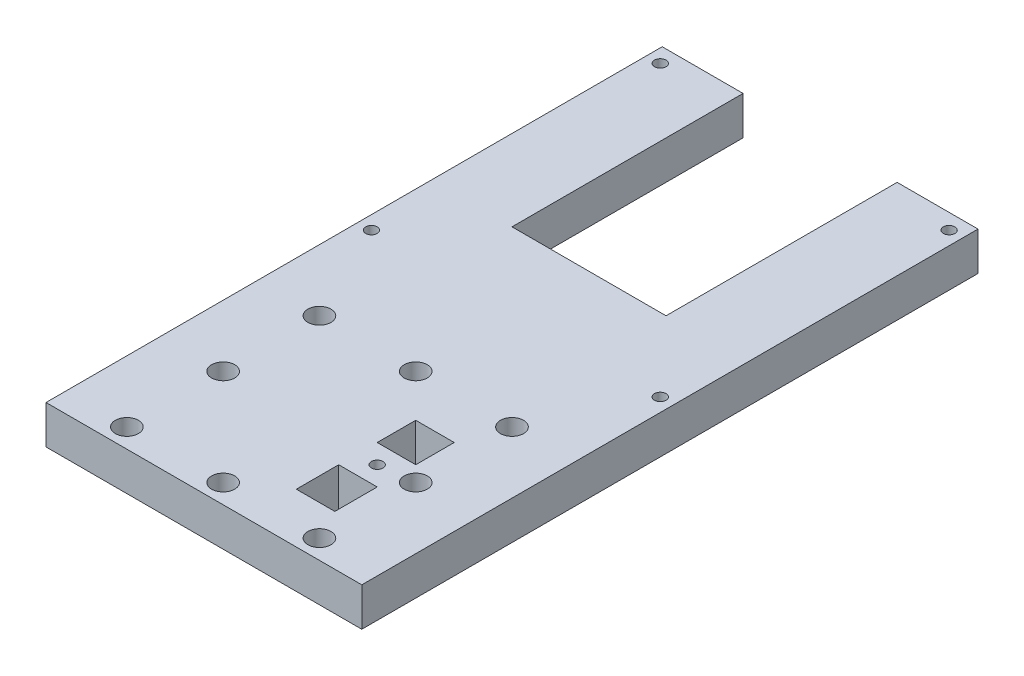
ISO-10303-21;
HEADER;
FILE_DESCRIPTION(('STEP AP214'),'2;1');
FILE_NAME('part.step','',(''),(''),'','','');
FILE_SCHEMA(('AUTOMOTIVE_DESIGN { 1 0 10303 214 1 1 1 1 }'));
ENDSEC;
DATA;
#1=APPLICATION_CONTEXT('core data for automotive mechanical design processes');
#2=APPLICATION_PROTOCOL_DEFINITION('international standard','automotive_design',2000,#1);
#3=PRODUCT_CONTEXT('',#1,'mechanical');
#4=PRODUCT('Part','Part','',(#3));
#5=PRODUCT_RELATED_PRODUCT_CATEGORY('part','',(#4));
#6=PRODUCT_DEFINITION_FORMATION('','',#4);
#7=PRODUCT_DEFINITION_CONTEXT('part definition',#1,'design');
#8=PRODUCT_DEFINITION('design','',#6,#7);
#9=PRODUCT_DEFINITION_SHAPE('','',#8);
#10=(LENGTH_UNIT() NAMED_UNIT(*) SI_UNIT(.MILLI.,.METRE.));
#11=(NAMED_UNIT(*) PLANE_ANGLE_UNIT() SI_UNIT($,.RADIAN.));
#12=(NAMED_UNIT(*) SI_UNIT($,.STERADIAN.) SOLID_ANGLE_UNIT());
#13=UNCERTAINTY_MEASURE_WITH_UNIT(LENGTH_MEASURE(1.E-05),#10,'distance_accuracy_value','');
#14=(GEOMETRIC_REPRESENTATION_CONTEXT(3) GLOBAL_UNCERTAINTY_ASSIGNED_CONTEXT((#13)) GLOBAL_UNIT_ASSIGNED_CONTEXT((#10,
#11,#12)) REPRESENTATION_CONTEXT('',''));
#15=CARTESIAN_POINT('',(0.,0.,0.));
#16=DIRECTION('',(0.,0.,1.));
#17=DIRECTION('',(1.,0.,0.));
#18=AXIS2_PLACEMENT_3D('',#15,#16,#17);
#19=CARTESIAN_POINT('',(0.,10.,0.));
#20=DIRECTION('',(0.,1.,0.));
#21=DIRECTION('',(0.,0.,1.));
#22=AXIS2_PLACEMENT_3D('',#19,#20,#21);
#23=PLANE('',#22);
#24=CARTESIAN_POINT('',(-8.03079687654243,10.,59.7441153686358));
#25=DIRECTION('',(0.,1.,0.));
#26=DIRECTION('',(0.,0.,1.));
#27=AXIS2_PLACEMENT_3D('',#24,#25,#26);
#28=CIRCLE('',#27,3.);
#29=CARTESIAN_POINT('',(-8.03079687654243,10.,62.7441153686358));
#30=VERTEX_POINT('',#29);
#31=EDGE_CURVE('E429',#30,#30,#28,.T.);
#32=ORIENTED_EDGE('',*,*,#31,.F.);
#33=EDGE_LOOP('',(#32));
#34=FACE_BOUND('',#33,.T.);
#35=CARTESIAN_POINT('',(-33.0307968765424,10.,34.7441153686358));
#36=DIRECTION('',(0.,1.,0.));
#37=DIRECTION('',(0.,0.,1.));
#38=AXIS2_PLACEMENT_3D('',#35,#36,#37);
#39=CIRCLE('',#38,3.);
#40=CARTESIAN_POINT('',(-33.0307968765424,10.,37.7441153686358));
#41=VERTEX_POINT('',#40);
#42=EDGE_CURVE('E437',#41,#41,#39,.T.);
#43=ORIENTED_EDGE('',*,*,#42,.F.);
#44=EDGE_LOOP('',(#43));
#45=FACE_BOUND('',#44,.T.);
#46=DIRECTION('',(-1.,0.,0.));
#47=VECTOR('',#46,1.);
#48=CARTESIAN_POINT('',(12.9692031234576,10.,20.7441153686358));
#49=LINE('',#48,#47);
#50=CARTESIAN_POINT('',(12.9692031234576,10.,20.7441153686358));
#51=VERTEX_POINT('',#50);
#52=CARTESIAN_POINT('',(2.96920312345755,10.,20.7441153686358));
#53=VERTEX_POINT('',#52);
#54=EDGE_CURVE('E155',#51,#53,#49,.T.);
#55=ORIENTED_EDGE('',*,*,#54,.F.);
#56=DIRECTION('',(0.,0.,-1.));
#57=VECTOR('',#56,1.);
#58=CARTESIAN_POINT('',(12.9692031234576,10.,30.7441153686358));
#59=LINE('',#58,#57);
#60=CARTESIAN_POINT('',(12.9692031234576,10.,30.7441153686358));
#61=VERTEX_POINT('',#60);
#62=EDGE_CURVE('E147',#61,#51,#59,.T.);
#63=ORIENTED_EDGE('',*,*,#62,.F.);
#64=DIRECTION('',(1.,0.,0.));
#65=VECTOR('',#64,1.);
#66=CARTESIAN_POINT('',(12.9692031234576,10.,30.7441153686358));
#67=LINE('',#66,#65);
#68=CARTESIAN_POINT('',(2.96920312345755,10.,30.7441153686358));
#69=VERTEX_POINT('',#68);
#70=EDGE_CURVE('E170',#69,#61,#67,.T.);
#71=ORIENTED_EDGE('',*,*,#70,.F.);
#72=DIRECTION('',(0.,0.,1.));
#73=VECTOR('',#72,1.);
#74=CARTESIAN_POINT('',(2.96920312345755,10.,30.7441153686358));
#75=LINE('',#74,#73);
#76=EDGE_CURVE('E168',#53,#69,#75,.T.);
#77=ORIENTED_EDGE('',*,*,#76,.F.);
#78=EDGE_LOOP('',(#55,#63,#71,#77));
#79=FACE_BOUND('',#78,.T.);
#80=CARTESIAN_POINT('',(-45.5307968765424,10.,-16.2558846313642));
#81=DIRECTION('',(0.,1.,0.));
#82=DIRECTION('',(0.,0.,1.));
#83=AXIS2_PLACEMENT_3D('',#80,#81,#82);
#84=CIRCLE('',#83,1.5);
#85=CARTESIAN_POINT('',(-45.5307968765424,10.,-14.7558846313642));
#86=VERTEX_POINT('',#85);
#87=EDGE_CURVE('E186',#86,#86,#84,.T.);
#88=ORIENTED_EDGE('',*,*,#87,.F.);
#89=EDGE_LOOP('',(#88));
#90=FACE_BOUND('',#89,.T.);
#91=CARTESIAN_POINT('',(29.4692031234568,10.,-91.2558846313642));
#92=DIRECTION('',(0.,1.,0.));
#93=DIRECTION('',(0.,0.,1.));
#94=AXIS2_PLACEMENT_3D('',#91,#92,#93);
#95=CIRCLE('',#94,1.5);
#96=CARTESIAN_POINT('',(29.4692031234568,10.,-89.7558846313642));
#97=VERTEX_POINT('',#96);
#98=EDGE_CURVE('E198',#97,#97,#95,.T.);
#99=ORIENTED_EDGE('',*,*,#98,.F.);
#100=EDGE_LOOP('',(#99));
#101=FACE_BOUND('',#100,.T.);
#102=CARTESIAN_POINT('',(-33.0307968765424,10.,9.7441153686358));
#103=DIRECTION('',(0.,1.,0.));
#104=DIRECTION('',(0.,0.,1.));
#105=AXIS2_PLACEMENT_3D('',#102,#103,#104);
#106=CIRCLE('',#105,3.);
#107=CARTESIAN_POINT('',(-33.0307968765424,10.,12.7441153686358));
#108=VERTEX_POINT('',#107);
#109=EDGE_CURVE('E241',#108,#108,#106,.T.);
#110=ORIENTED_EDGE('',*,*,#109,.F.);
#111=EDGE_LOOP('',(#110));
#112=FACE_BOUND('',#111,.T.);
#113=CARTESIAN_POINT('',(16.9692031234577,10.,59.7441153686358));
#114=DIRECTION('',(0.,1.,0.));
#115=DIRECTION('',(0.,0.,1.));
#116=AXIS2_PLACEMENT_3D('',#113,#114,#115);
#117=CIRCLE('',#116,3.);
#118=CARTESIAN_POINT('',(16.9692031234577,10.,62.7441153686358));
#119=VERTEX_POINT('',#118);
#120=EDGE_CURVE('E253',#119,#119,#117,.T.);
#121=ORIENTED_EDGE('',*,*,#120,.F.);
#122=EDGE_LOOP('',(#121));
#123=FACE_BOUND('',#122,.T.);
#124=DIRECTION('',(0.,0.,-1.));
#125=VECTOR('',#124,1.);
#126=CARTESIAN_POINT('',(32.9692031234576,10.,64.7441153686358));
#127=LINE('',#126,#125);
#128=CARTESIAN_POINT('',(32.9692031234576,10.,64.7441153686358));
#129=VERTEX_POINT('',#128);
#130=CARTESIAN_POINT('',(32.9692031234576,10.,-95.2558846313642));
#131=VERTEX_POINT('',#130);
#132=EDGE_CURVE('E265',#129,#131,#127,.T.);
#133=ORIENTED_EDGE('',*,*,#132,.T.);
#134=DIRECTION('',(-1.,0.,0.));
#135=VECTOR('',#134,1.);
#136=CARTESIAN_POINT('',(32.9692031234576,10.,-95.2558846313642));
#137=LINE('',#136,#135);
#138=CARTESIAN_POINT('',(11.9692031234576,10.,-95.2558846313642));
#139=VERTEX_POINT('',#138);
#140=EDGE_CURVE('E268',#131,#139,#137,.T.);
#141=ORIENTED_EDGE('',*,*,#140,.T.);
#142=DIRECTION('',(0.,0.,1.));
#143=VECTOR('',#142,1.);
#144=CARTESIAN_POINT('',(11.9692031234576,10.,-95.2558846313642));
#145=LINE('',#144,#143);
#146=CARTESIAN_POINT('',(11.9692031234576,10.,-35.2558846313642));
#147=VERTEX_POINT('',#146);
#148=EDGE_CURVE('E271',#139,#147,#145,.T.);
#149=ORIENTED_EDGE('',*,*,#148,.T.);
#150=DIRECTION('',(-1.,0.,0.));
#151=VECTOR('',#150,1.);
#152=CARTESIAN_POINT('',(-28.0307968765424,10.,-35.2558846313642));
#153=LINE('',#152,#151);
#154=CARTESIAN_POINT('',(-28.0307968765424,10.,-35.2558846313642));
#155=VERTEX_POINT('',#154);
#156=EDGE_CURVE('E273',#147,#155,#153,.T.);
#157=ORIENTED_EDGE('',*,*,#156,.T.);
#158=DIRECTION('',(0.,0.,-1.));
#159=VECTOR('',#158,1.);
#160=CARTESIAN_POINT('',(-28.0307968765424,10.,-95.2558846313642));
#161=LINE('',#160,#159);
#162=CARTESIAN_POINT('',(-28.0307968765424,10.,-95.2558846313642));
#163=VERTEX_POINT('',#162);
#164=EDGE_CURVE('E275',#155,#163,#161,.T.);
#165=ORIENTED_EDGE('',*,*,#164,.T.);
#166=DIRECTION('',(-1.,0.,0.));
#167=VECTOR('',#166,1.);
#168=CARTESIAN_POINT('',(-28.0307968765424,10.,-95.2558846313642));
#169=LINE('',#168,#167);
#170=CARTESIAN_POINT('',(-49.0307968765424,10.,-95.2558846313642));
#171=VERTEX_POINT('',#170);
#172=EDGE_CURVE('E277',#163,#171,#169,.T.);
#173=ORIENTED_EDGE('',*,*,#172,.T.);
#174=DIRECTION('',(0.,0.,1.));
#175=VECTOR('',#174,1.);
#176=CARTESIAN_POINT('',(-49.0307968765424,10.,64.7441153686358));
#177=LINE('',#176,#175);
#178=CARTESIAN_POINT('',(-49.0307968765424,10.,64.7441153686358));
#179=VERTEX_POINT('',#178);
#180=EDGE_CURVE('E279',#171,#179,#177,.T.);
#181=ORIENTED_EDGE('',*,*,#180,.T.);
#182=DIRECTION('',(1.,0.,0.));
#183=VECTOR('',#182,1.);
#184=CARTESIAN_POINT('',(32.9692031234576,10.,64.7441153686358));
#185=LINE('',#184,#183);
#186=EDGE_CURVE('E281',#179,#129,#185,.T.);
#187=ORIENTED_EDGE('',*,*,#186,.T.);
#188=EDGE_LOOP('',(#133,#141,#149,#157,#165,#173,#181,#187));
#189=FACE_BOUND('',#188,.T.);
#190=CARTESIAN_POINT('',(-33.0307968765423,10.,59.7441153686358));
#191=DIRECTION('',(0.,1.,0.));
#192=DIRECTION('',(0.,0.,1.));
#193=AXIS2_PLACEMENT_3D('',#190,#191,#192);
#194=CIRCLE('',#193,3.);
#195=CARTESIAN_POINT('',(-33.0307968765423,10.,62.7441153686358));
#196=VERTEX_POINT('',#195);
#197=EDGE_CURVE('E259',#196,#196,#194,.T.);
#198=ORIENTED_EDGE('',*,*,#197,.F.);
#199=EDGE_LOOP('',(#198));
#200=FACE_BOUND('',#199,.T.);
#201=CARTESIAN_POINT('',(16.9692031234576,10.,9.7441153686358));
#202=DIRECTION('',(0.,1.,0.));
#203=DIRECTION('',(0.,0.,1.));
#204=AXIS2_PLACEMENT_3D('',#201,#202,#203);
#205=CIRCLE('',#204,3.);
#206=CARTESIAN_POINT('',(16.9692031234576,10.,12.7441153686358));
#207=VERTEX_POINT('',#206);
#208=EDGE_CURVE('E247',#207,#207,#205,.T.);
#209=ORIENTED_EDGE('',*,*,#208,.F.);
#210=EDGE_LOOP('',(#209));
#211=FACE_BOUND('',#210,.T.);
#212=CARTESIAN_POINT('',(-45.5307968765432,10.,-91.2558846313642));
#213=DIRECTION('',(0.,1.,0.));
#214=DIRECTION('',(0.,0.,1.));
#215=AXIS2_PLACEMENT_3D('',#212,#213,#214);
#216=CIRCLE('',#215,1.5);
#217=CARTESIAN_POINT('',(-45.5307968765432,10.,-89.7558846313642));
#218=VERTEX_POINT('',#217);
#219=EDGE_CURVE('E235',#218,#218,#216,.T.);
#220=ORIENTED_EDGE('',*,*,#219,.F.);
#221=EDGE_LOOP('',(#220));
#222=FACE_BOUND('',#221,.T.);
#223=DIRECTION('',(-1.,0.,0.));
#224=VECTOR('',#223,1.);
#225=CARTESIAN_POINT('',(12.9692031234575,10.,40.7441153686358));
#226=LINE('',#225,#224);
#227=CARTESIAN_POINT('',(12.9692031234575,10.,40.7441153686358));
#228=VERTEX_POINT('',#227);
#229=CARTESIAN_POINT('',(2.96920312345755,10.,40.7441153686358));
#230=VERTEX_POINT('',#229);
#231=EDGE_CURVE('E206',#228,#230,#226,.T.);
#232=ORIENTED_EDGE('',*,*,#231,.F.);
#233=DIRECTION('',(0.,0.,-1.));
#234=VECTOR('',#233,1.);
#235=CARTESIAN_POINT('',(12.9692031234575,10.,51.7441153686358));
#236=LINE('',#235,#234);
#237=CARTESIAN_POINT('',(12.9692031234575,10.,51.7441153686358));
#238=VERTEX_POINT('',#237);
#239=EDGE_CURVE('E204',#238,#228,#236,.T.);
#240=ORIENTED_EDGE('',*,*,#239,.F.);
#241=DIRECTION('',(1.,0.,0.));
#242=VECTOR('',#241,1.);
#243=CARTESIAN_POINT('',(12.9692031234575,10.,51.7441153686358));
#244=LINE('',#243,#242);
#245=CARTESIAN_POINT('',(2.96920312345755,10.,51.7441153686358));
#246=VERTEX_POINT('',#245);
#247=EDGE_CURVE('E212',#246,#238,#244,.T.);
#248=ORIENTED_EDGE('',*,*,#247,.F.);
#249=DIRECTION('',(0.,0.,1.));
#250=VECTOR('',#249,1.);
#251=CARTESIAN_POINT('',(2.96920312345755,10.,51.7441153686358));
#252=LINE('',#251,#250);
#253=EDGE_CURVE('E209',#230,#246,#252,.T.);
#254=ORIENTED_EDGE('',*,*,#253,.F.);
#255=EDGE_LOOP('',(#232,#240,#248,#254));
#256=FACE_BOUND('',#255,.T.);
#257=CARTESIAN_POINT('',(29.4692031234576,10.,-16.2558846313642));
#258=DIRECTION('',(0.,1.,0.));
#259=DIRECTION('',(0.,0.,1.));
#260=AXIS2_PLACEMENT_3D('',#257,#258,#259);
#261=CIRCLE('',#260,1.5);
#262=CARTESIAN_POINT('',(29.4692031234576,10.,-14.7558846313642));
#263=VERTEX_POINT('',#262);
#264=EDGE_CURVE('E192',#263,#263,#261,.T.);
#265=ORIENTED_EDGE('',*,*,#264,.F.);
#266=EDGE_LOOP('',(#265));
#267=FACE_BOUND('',#266,.T.);
#268=CARTESIAN_POINT('',(-8.03079687654243,10.,9.7441153686358));
#269=DIRECTION('',(0.,1.,0.));
#270=DIRECTION('',(0.,0.,1.));
#271=AXIS2_PLACEMENT_3D('',#268,#269,#270);
#272=CIRCLE('',#271,3.);
#273=CARTESIAN_POINT('',(-8.03079687654243,10.,12.7441153686358));
#274=VERTEX_POINT('',#273);
#275=EDGE_CURVE('E176',#274,#274,#272,.T.);
#276=ORIENTED_EDGE('',*,*,#275,.F.);
#277=EDGE_LOOP('',(#276));
#278=FACE_BOUND('',#277,.T.);
#279=CARTESIAN_POINT('',(16.9692031234576,10.,34.7441153686358));
#280=DIRECTION('',(0.,1.,0.));
#281=DIRECTION('',(0.,0.,1.));
#282=AXIS2_PLACEMENT_3D('',#279,#280,#281);
#283=CIRCLE('',#282,3.);
#284=CARTESIAN_POINT('',(16.9692031234576,10.,37.7441153686358));
#285=VERTEX_POINT('',#284);
#286=EDGE_CURVE('E433',#285,#285,#283,.T.);
#287=ORIENTED_EDGE('',*,*,#286,.F.);
#288=EDGE_LOOP('',(#287));
#289=FACE_BOUND('',#288,.T.);
#290=CARTESIAN_POINT('',(7.96920312345755,10.,35.7441153686358));
#291=DIRECTION('',(0.,1.,0.));
#292=DIRECTION('',(0.,0.,1.));
#293=AXIS2_PLACEMENT_3D('',#290,#291,#292);
#294=CIRCLE('',#293,1.5);
#295=CARTESIAN_POINT('',(7.96920312345755,10.,37.2441153686358));
#296=VERTEX_POINT('',#295);
#297=EDGE_CURVE('E424',#296,#296,#294,.T.);
#298=ORIENTED_EDGE('',*,*,#297,.F.);
#299=EDGE_LOOP('',(#298));
#300=FACE_BOUND('',#299,.T.);
#301=ADVANCED_FACE('F34',(#34,#45,#79,#90,#101,#112,#123,#189,#200,#211,#222,#256,#267,#278,
#289,#300),#23,.T.);
#302=CARTESIAN_POINT('',(0.,0.,0.));
#303=DIRECTION('',(0.,1.,0.));
#304=DIRECTION('',(0.,0.,1.));
#305=AXIS2_PLACEMENT_3D('',#302,#303,#304);
#306=PLANE('',#305);
#307=CARTESIAN_POINT('',(-45.5307968765424,0.,-16.2558846313642));
#308=DIRECTION('',(0.,1.,0.));
#309=DIRECTION('',(0.,0.,1.));
#310=AXIS2_PLACEMENT_3D('',#307,#308,#309);
#311=CIRCLE('',#310,1.5);
#312=CARTESIAN_POINT('',(-45.5307968765424,0.,-14.7558846313642));
#313=VERTEX_POINT('',#312);
#314=EDGE_CURVE('E163',#313,#313,#311,.T.);
#315=ORIENTED_EDGE('',*,*,#314,.T.);
#316=EDGE_LOOP('',(#315));
#317=FACE_BOUND('',#316,.T.);
#318=CARTESIAN_POINT('',(29.4692031234576,0.,-16.2558846313642));
#319=DIRECTION('',(0.,1.,0.));
#320=DIRECTION('',(0.,0.,1.));
#321=AXIS2_PLACEMENT_3D('',#318,#319,#320);
#322=CIRCLE('',#321,1.5);
#323=CARTESIAN_POINT('',(29.4692031234576,0.,-14.7558846313642));
#324=VERTEX_POINT('',#323);
#325=EDGE_CURVE('E189',#324,#324,#322,.T.);
#326=ORIENTED_EDGE('',*,*,#325,.T.);
#327=EDGE_LOOP('',(#326));
#328=FACE_BOUND('',#327,.T.);
#329=CARTESIAN_POINT('',(29.4692031234568,0.,-91.2558846313642));
#330=DIRECTION('',(0.,1.,0.));
#331=DIRECTION('',(0.,0.,1.));
#332=AXIS2_PLACEMENT_3D('',#329,#330,#331);
#333=CIRCLE('',#332,1.5);
#334=CARTESIAN_POINT('',(29.4692031234568,0.,-89.7558846313642));
#335=VERTEX_POINT('',#334);
#336=EDGE_CURVE('E195',#335,#335,#333,.T.);
#337=ORIENTED_EDGE('',*,*,#336,.T.);
#338=EDGE_LOOP('',(#337));
#339=FACE_BOUND('',#338,.T.);
#340=DIRECTION('',(0.,0.,-1.));
#341=VECTOR('',#340,1.);
#342=CARTESIAN_POINT('',(12.9692031234575,0.,51.7441153686358));
#343=LINE('',#342,#341);
#344=CARTESIAN_POINT('',(12.9692031234575,0.,51.7441153686358));
#345=VERTEX_POINT('',#344);
#346=CARTESIAN_POINT('',(12.9692031234575,0.,40.7441153686358));
#347=VERTEX_POINT('',#346);
#348=EDGE_CURVE('E201',#345,#347,#343,.T.);
#349=ORIENTED_EDGE('',*,*,#348,.T.);
#350=DIRECTION('',(-1.,0.,0.));
#351=VECTOR('',#350,1.);
#352=CARTESIAN_POINT('',(12.9692031234575,0.,40.7441153686358));
#353=LINE('',#352,#351);
#354=CARTESIAN_POINT('',(2.96920312345755,0.,40.7441153686358));
#355=VERTEX_POINT('',#354);
#356=EDGE_CURVE('E217',#347,#355,#353,.T.);
#357=ORIENTED_EDGE('',*,*,#356,.T.);
#358=DIRECTION('',(0.,0.,1.));
#359=VECTOR('',#358,1.);
#360=CARTESIAN_POINT('',(2.96920312345755,0.,51.7441153686358));
#361=LINE('',#360,#359);
#362=CARTESIAN_POINT('',(2.96920312345755,0.,51.7441153686358));
#363=VERTEX_POINT('',#362);
#364=EDGE_CURVE('E220',#355,#363,#361,.T.);
#365=ORIENTED_EDGE('',*,*,#364,.T.);
#366=DIRECTION('',(1.,0.,0.));
#367=VECTOR('',#366,1.);
#368=CARTESIAN_POINT('',(12.9692031234575,0.,51.7441153686358));
#369=LINE('',#368,#367);
#370=EDGE_CURVE('E207',#363,#345,#369,.T.);
#371=ORIENTED_EDGE('',*,*,#370,.T.);
#372=EDGE_LOOP('',(#349,#357,#365,#371));
#373=FACE_BOUND('',#372,.T.);
#374=DIRECTION('',(0.,0.,-1.));
#375=VECTOR('',#374,1.);
#376=CARTESIAN_POINT('',(32.9692031234576,0.,64.7441153686358));
#377=LINE('',#376,#375);
#378=CARTESIAN_POINT('',(32.9692031234576,0.,64.7441153686358));
#379=VERTEX_POINT('',#378);
#380=CARTESIAN_POINT('',(32.9692031234576,0.,-95.2558846313642));
#381=VERTEX_POINT('',#380);
#382=EDGE_CURVE('E262',#379,#381,#377,.T.);
#383=ORIENTED_EDGE('',*,*,#382,.F.);
#384=DIRECTION('',(1.,0.,0.));
#385=VECTOR('',#384,1.);
#386=CARTESIAN_POINT('',(32.9692031234576,0.,64.7441153686358));
#387=LINE('',#386,#385);
#388=CARTESIAN_POINT('',(-49.0307968765424,0.,64.7441153686358));
#389=VERTEX_POINT('',#388);
#390=EDGE_CURVE('E269',#389,#379,#387,.T.);
#391=ORIENTED_EDGE('',*,*,#390,.F.);
#392=DIRECTION('',(0.,0.,1.));
#393=VECTOR('',#392,1.);
#394=CARTESIAN_POINT('',(-49.0307968765424,0.,64.7441153686358));
#395=LINE('',#394,#393);
#396=CARTESIAN_POINT('',(-49.0307968765424,0.,-95.2558846313642));
#397=VERTEX_POINT('',#396);
#398=EDGE_CURVE('E296',#397,#389,#395,.T.);
#399=ORIENTED_EDGE('',*,*,#398,.F.);
#400=DIRECTION('',(-1.,0.,0.));
#401=VECTOR('',#400,1.);
#402=CARTESIAN_POINT('',(-28.0307968765424,0.,-95.2558846313642));
#403=LINE('',#402,#401);
#404=CARTESIAN_POINT('',(-28.0307968765424,0.,-95.2558846313642));
#405=VERTEX_POINT('',#404);
#406=EDGE_CURVE('E294',#405,#397,#403,.T.);
#407=ORIENTED_EDGE('',*,*,#406,.F.);
#408=DIRECTION('',(0.,0.,-1.));
#409=VECTOR('',#408,1.);
#410=CARTESIAN_POINT('',(-28.0307968765424,0.,-95.2558846313642));
#411=LINE('',#410,#409);
#412=CARTESIAN_POINT('',(-28.0307968765424,0.,-35.2558846313642));
#413=VERTEX_POINT('',#412);
#414=EDGE_CURVE('E292',#413,#405,#411,.T.);
#415=ORIENTED_EDGE('',*,*,#414,.F.);
#416=DIRECTION('',(-1.,0.,0.));
#417=VECTOR('',#416,1.);
#418=CARTESIAN_POINT('',(-28.0307968765424,0.,-35.2558846313642));
#419=LINE('',#418,#417);
#420=CARTESIAN_POINT('',(11.9692031234576,0.,-35.2558846313642));
#421=VERTEX_POINT('',#420);
#422=EDGE_CURVE('E290',#421,#413,#419,.T.);
#423=ORIENTED_EDGE('',*,*,#422,.F.);
#424=DIRECTION('',(0.,0.,1.));
#425=VECTOR('',#424,1.);
#426=CARTESIAN_POINT('',(11.9692031234576,0.,-95.2558846313642));
#427=LINE('',#426,#425);
#428=CARTESIAN_POINT('',(11.9692031234576,0.,-95.2558846313642));
#429=VERTEX_POINT('',#428);
#430=EDGE_CURVE('E288',#429,#421,#427,.T.);
#431=ORIENTED_EDGE('',*,*,#430,.F.);
#432=DIRECTION('',(-1.,0.,0.));
#433=VECTOR('',#432,1.);
#434=CARTESIAN_POINT('',(32.9692031234576,0.,-95.2558846313642));
#435=LINE('',#434,#433);
#436=EDGE_CURVE('E286',#381,#429,#435,.T.);
#437=ORIENTED_EDGE('',*,*,#436,.F.);
#438=EDGE_LOOP('',(#383,#391,#399,#407,#415,#423,#431,#437));
#439=FACE_BOUND('',#438,.T.);
#440=CARTESIAN_POINT('',(-33.0307968765423,0.,59.7441153686358));
#441=DIRECTION('',(0.,1.,0.));
#442=DIRECTION('',(0.,0.,1.));
#443=AXIS2_PLACEMENT_3D('',#440,#441,#442);
#444=CIRCLE('',#443,3.);
#445=CARTESIAN_POINT('',(-33.0307968765423,0.,62.7441153686358));
#446=VERTEX_POINT('',#445);
#447=EDGE_CURVE('E256',#446,#446,#444,.T.);
#448=ORIENTED_EDGE('',*,*,#447,.T.);
#449=EDGE_LOOP('',(#448));
#450=FACE_BOUND('',#449,.T.);
#451=CARTESIAN_POINT('',(16.9692031234577,0.,59.7441153686358));
#452=DIRECTION('',(0.,1.,0.));
#453=DIRECTION('',(0.,0.,1.));
#454=AXIS2_PLACEMENT_3D('',#451,#452,#453);
#455=CIRCLE('',#454,3.);
#456=CARTESIAN_POINT('',(16.9692031234577,0.,62.7441153686358));
#457=VERTEX_POINT('',#456);
#458=EDGE_CURVE('E250',#457,#457,#455,.T.);
#459=ORIENTED_EDGE('',*,*,#458,.T.);
#460=EDGE_LOOP('',(#459));
#461=FACE_BOUND('',#460,.T.);
#462=CARTESIAN_POINT('',(16.9692031234576,0.,9.7441153686358));
#463=DIRECTION('',(0.,1.,0.));
#464=DIRECTION('',(0.,0.,1.));
#465=AXIS2_PLACEMENT_3D('',#462,#463,#464);
#466=CIRCLE('',#465,3.);
#467=CARTESIAN_POINT('',(16.9692031234576,0.,12.7441153686358));
#468=VERTEX_POINT('',#467);
#469=EDGE_CURVE('E244',#468,#468,#466,.T.);
#470=ORIENTED_EDGE('',*,*,#469,.T.);
#471=EDGE_LOOP('',(#470));
#472=FACE_BOUND('',#471,.T.);
#473=CARTESIAN_POINT('',(-33.0307968765424,0.,9.7441153686358));
#474=DIRECTION('',(0.,1.,0.));
#475=DIRECTION('',(0.,0.,1.));
#476=AXIS2_PLACEMENT_3D('',#473,#474,#475);
#477=CIRCLE('',#476,3.);
#478=CARTESIAN_POINT('',(-33.0307968765424,0.,12.7441153686358));
#479=VERTEX_POINT('',#478);
#480=EDGE_CURVE('E238',#479,#479,#477,.T.);
#481=ORIENTED_EDGE('',*,*,#480,.T.);
#482=EDGE_LOOP('',(#481));
#483=FACE_BOUND('',#482,.T.);
#484=CARTESIAN_POINT('',(-45.5307968765432,0.,-91.2558846313642));
#485=DIRECTION('',(0.,1.,0.));
#486=DIRECTION('',(0.,0.,1.));
#487=AXIS2_PLACEMENT_3D('',#484,#485,#486);
#488=CIRCLE('',#487,1.5);
#489=CARTESIAN_POINT('',(-45.5307968765432,0.,-89.7558846313642));
#490=VERTEX_POINT('',#489);
#491=EDGE_CURVE('E234',#490,#490,#488,.T.);
#492=ORIENTED_EDGE('',*,*,#491,.T.);
#493=EDGE_LOOP('',(#492));
#494=FACE_BOUND('',#493,.T.);
#495=DIRECTION('',(0.,0.,-1.));
#496=VECTOR('',#495,1.);
#497=CARTESIAN_POINT('',(12.9692031234576,0.,30.7441153686358));
#498=LINE('',#497,#496);
#499=CARTESIAN_POINT('',(12.9692031234576,0.,30.7441153686358));
#500=VERTEX_POINT('',#499);
#501=CARTESIAN_POINT('',(12.9692031234576,0.,20.7441153686358));
#502=VERTEX_POINT('',#501);
#503=EDGE_CURVE('E57',#500,#502,#498,.T.);
#504=ORIENTED_EDGE('',*,*,#503,.T.);
#505=DIRECTION('',(-1.,0.,0.));
#506=VECTOR('',#505,1.);
#507=CARTESIAN_POINT('',(12.9692031234576,0.,20.7441153686358));
#508=LINE('',#507,#506);
#509=CARTESIAN_POINT('',(2.96920312345755,0.,20.7441153686358));
#510=VERTEX_POINT('',#509);
#511=EDGE_CURVE('E162',#502,#510,#508,.T.);
#512=ORIENTED_EDGE('',*,*,#511,.T.);
#513=DIRECTION('',(0.,0.,1.));
#514=VECTOR('',#513,1.);
#515=CARTESIAN_POINT('',(2.96920312345755,0.,30.7441153686358));
#516=LINE('',#515,#514);
#517=CARTESIAN_POINT('',(2.96920312345755,0.,30.7441153686358));
#518=VERTEX_POINT('',#517);
#519=EDGE_CURVE('E178',#510,#518,#516,.T.);
#520=ORIENTED_EDGE('',*,*,#519,.T.);
#521=DIRECTION('',(1.,0.,0.));
#522=VECTOR('',#521,1.);
#523=CARTESIAN_POINT('',(12.9692031234576,0.,30.7441153686358));
#524=LINE('',#523,#522);
#525=EDGE_CURVE('E156',#518,#500,#524,.T.);
#526=ORIENTED_EDGE('',*,*,#525,.T.);
#527=EDGE_LOOP('',(#504,#512,#520,#526));
#528=FACE_BOUND('',#527,.T.);
#529=CARTESIAN_POINT('',(-8.03079687654243,0.,9.7441153686358));
#530=DIRECTION('',(0.,1.,0.));
#531=DIRECTION('',(0.,0.,1.));
#532=AXIS2_PLACEMENT_3D('',#529,#530,#531);
#533=CIRCLE('',#532,3.);
#534=CARTESIAN_POINT('',(-8.03079687654243,0.,12.7441153686358));
#535=VERTEX_POINT('',#534);
#536=EDGE_CURVE('E407',#535,#535,#533,.T.);
#537=ORIENTED_EDGE('',*,*,#536,.T.);
#538=EDGE_LOOP('',(#537));
#539=FACE_BOUND('',#538,.T.);
#540=CARTESIAN_POINT('',(-33.0307968765424,0.,34.7441153686358));
#541=DIRECTION('',(0.,1.,0.));
#542=DIRECTION('',(0.,0.,1.));
#543=AXIS2_PLACEMENT_3D('',#540,#541,#542);
#544=CIRCLE('',#543,3.);
#545=CARTESIAN_POINT('',(-33.0307968765424,0.,37.7441153686358));
#546=VERTEX_POINT('',#545);
#547=EDGE_CURVE('E411',#546,#546,#544,.T.);
#548=ORIENTED_EDGE('',*,*,#547,.T.);
#549=EDGE_LOOP('',(#548));
#550=FACE_BOUND('',#549,.T.);
#551=CARTESIAN_POINT('',(16.9692031234576,0.,34.7441153686358));
#552=DIRECTION('',(0.,1.,0.));
#553=DIRECTION('',(0.,0.,1.));
#554=AXIS2_PLACEMENT_3D('',#551,#552,#553);
#555=CIRCLE('',#554,3.);
#556=CARTESIAN_POINT('',(16.9692031234576,0.,37.7441153686358));
#557=VERTEX_POINT('',#556);
#558=EDGE_CURVE('E415',#557,#557,#555,.T.);
#559=ORIENTED_EDGE('',*,*,#558,.T.);
#560=EDGE_LOOP('',(#559));
#561=FACE_BOUND('',#560,.T.);
#562=CARTESIAN_POINT('',(-8.03079687654243,0.,59.7441153686358));
#563=DIRECTION('',(0.,1.,0.));
#564=DIRECTION('',(0.,0.,1.));
#565=AXIS2_PLACEMENT_3D('',#562,#563,#564);
#566=CIRCLE('',#565,3.);
#567=CARTESIAN_POINT('',(-8.03079687654243,0.,62.7441153686358));
#568=VERTEX_POINT('',#567);
#569=EDGE_CURVE('E419',#568,#568,#566,.T.);
#570=ORIENTED_EDGE('',*,*,#569,.T.);
#571=EDGE_LOOP('',(#570));
#572=FACE_BOUND('',#571,.T.);
#573=CARTESIAN_POINT('',(7.96920312345755,0.,35.7441153686358));
#574=DIRECTION('',(0.,1.,0.));
#575=DIRECTION('',(0.,0.,1.));
#576=AXIS2_PLACEMENT_3D('',#573,#574,#575);
#577=CIRCLE('',#576,1.5);
#578=CARTESIAN_POINT('',(7.96920312345755,0.,37.2441153686358));
#579=VERTEX_POINT('',#578);
#580=EDGE_CURVE('E422',#579,#579,#577,.T.);
#581=ORIENTED_EDGE('',*,*,#580,.T.);
#582=EDGE_LOOP('',(#581));
#583=FACE_BOUND('',#582,.T.);
#584=ADVANCED_FACE('F326',(#317,#328,#339,#373,#439,#450,#461,#472,#483,#494,#528,#539,#550,
#561,#572,#583),#306,.F.);
#585=CARTESIAN_POINT('',(32.9692031234576,10.,64.7441153686358));
#586=DIRECTION('',(-1.,0.,0.));
#587=DIRECTION('',(0.,0.,1.));
#588=AXIS2_PLACEMENT_3D('',#585,#586,#587);
#589=PLANE('',#588);
#590=ORIENTED_EDGE('',*,*,#382,.T.);
#591=DIRECTION('',(0.,-1.,0.));
#592=VECTOR('',#591,1.);
#593=CARTESIAN_POINT('',(32.9692031234576,10.,-95.2558846313642));
#594=LINE('',#593,#592);
#595=EDGE_CURVE('E11',#131,#381,#594,.T.);
#596=ORIENTED_EDGE('',*,*,#595,.F.);
#597=ORIENTED_EDGE('',*,*,#132,.F.);
#598=DIRECTION('',(0.,-1.,0.));
#599=VECTOR('',#598,1.);
#600=CARTESIAN_POINT('',(32.9692031234576,10.,64.7441153686358));
#601=LINE('',#600,#599);
#602=EDGE_CURVE('E283',#129,#379,#601,.T.);
#603=ORIENTED_EDGE('',*,*,#602,.T.);
#604=EDGE_LOOP('',(#590,#596,#597,#603));
#605=FACE_BOUND('',#604,.T.);
#606=ADVANCED_FACE('F36',(#605),#589,.F.);
#607=CARTESIAN_POINT('',(32.9692031234576,10.,-95.2558846313642));
#608=DIRECTION('',(0.,0.,1.));
#609=DIRECTION('',(1.,0.,0.));
#610=AXIS2_PLACEMENT_3D('',#607,#608,#609);
#611=PLANE('',#610);
#612=ORIENTED_EDGE('',*,*,#436,.T.);
#613=DIRECTION('',(0.,-1.,0.));
#614=VECTOR('',#613,1.);
#615=CARTESIAN_POINT('',(11.9692031234576,10.,-95.2558846313642));
#616=LINE('',#615,#614);
#617=EDGE_CURVE('E42',#139,#429,#616,.T.);
#618=ORIENTED_EDGE('',*,*,#617,.F.);
#619=ORIENTED_EDGE('',*,*,#140,.F.);
#620=ORIENTED_EDGE('',*,*,#595,.T.);
#621=EDGE_LOOP('',(#612,#618,#619,#620));
#622=FACE_BOUND('',#621,.T.);
#623=ADVANCED_FACE('F344',(#622),#611,.F.);
#624=CARTESIAN_POINT('',(11.9692031234576,10.,-95.2558846313642));
#625=DIRECTION('',(1.,0.,0.));
#626=DIRECTION('',(0.,0.,-1.));
#627=AXIS2_PLACEMENT_3D('',#624,#625,#626);
#628=PLANE('',#627);
#629=ORIENTED_EDGE('',*,*,#430,.T.);
#630=DIRECTION('',(0.,-1.,0.));
#631=VECTOR('',#630,1.);
#632=CARTESIAN_POINT('',(11.9692031234576,10.,-35.2558846313642));
#633=LINE('',#632,#631);
#634=EDGE_CURVE('E313',#147,#421,#633,.T.);
#635=ORIENTED_EDGE('',*,*,#634,.F.);
#636=ORIENTED_EDGE('',*,*,#148,.F.);
#637=ORIENTED_EDGE('',*,*,#617,.T.);
#638=EDGE_LOOP('',(#629,#635,#636,#637));
#639=FACE_BOUND('',#638,.T.);
#640=ADVANCED_FACE('F320',(#639),#628,.F.);
#641=CARTESIAN_POINT('',(-28.0307968765424,10.,-35.2558846313642));
#642=DIRECTION('',(0.,0.,1.));
#643=DIRECTION('',(1.,0.,0.));
#644=AXIS2_PLACEMENT_3D('',#641,#642,#643);
#645=PLANE('',#644);
#646=ORIENTED_EDGE('',*,*,#422,.T.);
#647=DIRECTION('',(0.,-1.,0.));
#648=VECTOR('',#647,1.);
#649=CARTESIAN_POINT('',(-28.0307968765424,10.,-35.2558846313642));
#650=LINE('',#649,#648);
#651=EDGE_CURVE('E310',#155,#413,#650,.T.);
#652=ORIENTED_EDGE('',*,*,#651,.F.);
#653=ORIENTED_EDGE('',*,*,#156,.F.);
#654=ORIENTED_EDGE('',*,*,#634,.T.);
#655=EDGE_LOOP('',(#646,#652,#653,#654));
#656=FACE_BOUND('',#655,.T.);
#657=ADVANCED_FACE('F332',(#656),#645,.F.);
#658=CARTESIAN_POINT('',(-28.0307968765424,10.,-95.2558846313642));
#659=DIRECTION('',(-1.,0.,0.));
#660=DIRECTION('',(0.,0.,1.));
#661=AXIS2_PLACEMENT_3D('',#658,#659,#660);
#662=PLANE('',#661);
#663=ORIENTED_EDGE('',*,*,#414,.T.);
#664=DIRECTION('',(0.,-1.,0.));
#665=VECTOR('',#664,1.);
#666=CARTESIAN_POINT('',(-28.0307968765424,10.,-95.2558846313642));
#667=LINE('',#666,#665);
#668=EDGE_CURVE('E307',#163,#405,#667,.T.);
#669=ORIENTED_EDGE('',*,*,#668,.F.);
#670=ORIENTED_EDGE('',*,*,#164,.F.);
#671=ORIENTED_EDGE('',*,*,#651,.T.);
#672=EDGE_LOOP('',(#663,#669,#670,#671));
#673=FACE_BOUND('',#672,.T.);
#674=ADVANCED_FACE('F336',(#673),#662,.F.);
#675=CARTESIAN_POINT('',(-28.0307968765424,10.,-95.2558846313642));
#676=DIRECTION('',(0.,0.,1.));
#677=DIRECTION('',(1.,0.,0.));
#678=AXIS2_PLACEMENT_3D('',#675,#676,#677);
#679=PLANE('',#678);
#680=ORIENTED_EDGE('',*,*,#406,.T.);
#681=DIRECTION('',(0.,-1.,0.));
#682=VECTOR('',#681,1.);
#683=CARTESIAN_POINT('',(-49.0307968765424,10.,-95.2558846313642));
#684=LINE('',#683,#682);
#685=EDGE_CURVE('E304',#171,#397,#684,.T.);
#686=ORIENTED_EDGE('',*,*,#685,.F.);
#687=ORIENTED_EDGE('',*,*,#172,.F.);
#688=ORIENTED_EDGE('',*,*,#668,.T.);
#689=EDGE_LOOP('',(#680,#686,#687,#688));
#690=FACE_BOUND('',#689,.T.);
#691=ADVANCED_FACE('F357',(#690),#679,.F.);
#692=CARTESIAN_POINT('',(-49.0307968765424,10.,64.7441153686358));
#693=DIRECTION('',(1.,0.,0.));
#694=DIRECTION('',(0.,0.,-1.));
#695=AXIS2_PLACEMENT_3D('',#692,#693,#694);
#696=PLANE('',#695);
#697=ORIENTED_EDGE('',*,*,#398,.T.);
#698=DIRECTION('',(0.,-1.,0.));
#699=VECTOR('',#698,1.);
#700=CARTESIAN_POINT('',(-49.0307968765424,10.,64.7441153686358));
#701=LINE('',#700,#699);
#702=EDGE_CURVE('E301',#179,#389,#701,.T.);
#703=ORIENTED_EDGE('',*,*,#702,.F.);
#704=ORIENTED_EDGE('',*,*,#180,.F.);
#705=ORIENTED_EDGE('',*,*,#685,.T.);
#706=EDGE_LOOP('',(#697,#703,#704,#705));
#707=FACE_BOUND('',#706,.T.);
#708=ADVANCED_FACE('F355',(#707),#696,.F.);
#709=CARTESIAN_POINT('',(32.9692031234576,10.,64.7441153686358));
#710=DIRECTION('',(0.,0.,-1.));
#711=DIRECTION('',(-1.,0.,0.));
#712=AXIS2_PLACEMENT_3D('',#709,#710,#711);
#713=PLANE('',#712);
#714=ORIENTED_EDGE('',*,*,#390,.T.);
#715=ORIENTED_EDGE('',*,*,#602,.F.);
#716=ORIENTED_EDGE('',*,*,#186,.F.);
#717=ORIENTED_EDGE('',*,*,#702,.T.);
#718=EDGE_LOOP('',(#714,#715,#716,#717));
#719=FACE_BOUND('',#718,.T.);
#720=ADVANCED_FACE('F350',(#719),#713,.F.);
#721=CARTESIAN_POINT('',(-33.0307968765423,10.,59.7441153686358));
#722=DIRECTION('',(0.,-1.,0.));
#723=DIRECTION('',(0.,0.,-1.));
#724=AXIS2_PLACEMENT_3D('',#721,#722,#723);
#725=CYLINDRICAL_SURFACE('',#724,3.);
#726=ORIENTED_EDGE('',*,*,#197,.T.);
#727=EDGE_LOOP('',(#726));
#728=FACE_BOUND('',#727,.T.);
#729=ORIENTED_EDGE('',*,*,#447,.F.);
#730=EDGE_LOOP('',(#729));
#731=FACE_BOUND('',#730,.T.);
#732=ADVANCED_FACE('F377',(#728,#731),#725,.F.);
#733=CARTESIAN_POINT('',(16.9692031234577,10.,59.7441153686358));
#734=DIRECTION('',(0.,-1.,0.));
#735=DIRECTION('',(0.,0.,-1.));
#736=AXIS2_PLACEMENT_3D('',#733,#734,#735);
#737=CYLINDRICAL_SURFACE('',#736,3.);
#738=ORIENTED_EDGE('',*,*,#120,.T.);
#739=EDGE_LOOP('',(#738));
#740=FACE_BOUND('',#739,.T.);
#741=ORIENTED_EDGE('',*,*,#458,.F.);
#742=EDGE_LOOP('',(#741));
#743=FACE_BOUND('',#742,.T.);
#744=ADVANCED_FACE('F384',(#740,#743),#737,.F.);
#745=CARTESIAN_POINT('',(16.9692031234576,10.,9.7441153686358));
#746=DIRECTION('',(0.,-1.,0.));
#747=DIRECTION('',(0.,0.,-1.));
#748=AXIS2_PLACEMENT_3D('',#745,#746,#747);
#749=CYLINDRICAL_SURFACE('',#748,3.);
#750=ORIENTED_EDGE('',*,*,#208,.T.);
#751=EDGE_LOOP('',(#750));
#752=FACE_BOUND('',#751,.T.);
#753=ORIENTED_EDGE('',*,*,#469,.F.);
#754=EDGE_LOOP('',(#753));
#755=FACE_BOUND('',#754,.T.);
#756=ADVANCED_FACE('F389',(#752,#755),#749,.F.);
#757=CARTESIAN_POINT('',(-33.0307968765424,10.,9.7441153686358));
#758=DIRECTION('',(0.,-1.,0.));
#759=DIRECTION('',(0.,0.,-1.));
#760=AXIS2_PLACEMENT_3D('',#757,#758,#759);
#761=CYLINDRICAL_SURFACE('',#760,3.);
#762=ORIENTED_EDGE('',*,*,#109,.T.);
#763=EDGE_LOOP('',(#762));
#764=FACE_BOUND('',#763,.T.);
#765=ORIENTED_EDGE('',*,*,#480,.F.);
#766=EDGE_LOOP('',(#765));
#767=FACE_BOUND('',#766,.T.);
#768=ADVANCED_FACE('F514',(#764,#767),#761,.F.);
#769=CARTESIAN_POINT('',(-45.5307968765432,10.,-91.2558846313642));
#770=DIRECTION('',(0.,-1.,0.));
#771=DIRECTION('',(0.,0.,-1.));
#772=AXIS2_PLACEMENT_3D('',#769,#770,#771);
#773=CYLINDRICAL_SURFACE('',#772,1.5);
#774=ORIENTED_EDGE('',*,*,#219,.T.);
#775=EDGE_LOOP('',(#774));
#776=FACE_BOUND('',#775,.T.);
#777=ORIENTED_EDGE('',*,*,#491,.F.);
#778=EDGE_LOOP('',(#777));
#779=FACE_BOUND('',#778,.T.);
#780=ADVANCED_FACE('F510',(#776,#779),#773,.F.);
#781=CARTESIAN_POINT('',(12.9692031234575,10.,51.7441153686358));
#782=DIRECTION('',(-1.,0.,0.));
#783=DIRECTION('',(0.,0.,1.));
#784=AXIS2_PLACEMENT_3D('',#781,#782,#783);
#785=PLANE('',#784);
#786=ORIENTED_EDGE('',*,*,#348,.F.);
#787=DIRECTION('',(0.,-1.,0.));
#788=VECTOR('',#787,1.);
#789=CARTESIAN_POINT('',(12.9692031234575,10.,51.7441153686358));
#790=LINE('',#789,#788);
#791=EDGE_CURVE('E214',#238,#345,#790,.T.);
#792=ORIENTED_EDGE('',*,*,#791,.F.);
#793=ORIENTED_EDGE('',*,*,#239,.T.);
#794=DIRECTION('',(0.,-1.,0.));
#795=VECTOR('',#794,1.);
#796=CARTESIAN_POINT('',(12.9692031234575,10.,40.7441153686358));
#797=LINE('',#796,#795);
#798=EDGE_CURVE('E231',#228,#347,#797,.T.);
#799=ORIENTED_EDGE('',*,*,#798,.T.);
#800=EDGE_LOOP('',(#786,#792,#793,#799));
#801=FACE_BOUND('',#800,.T.);
#802=ADVANCED_FACE('F506',(#801),#785,.T.);
#803=CARTESIAN_POINT('',(12.9692031234575,10.,40.7441153686358));
#804=DIRECTION('',(0.,0.,1.));
#805=DIRECTION('',(1.,0.,0.));
#806=AXIS2_PLACEMENT_3D('',#803,#804,#805);
#807=PLANE('',#806);
#808=ORIENTED_EDGE('',*,*,#356,.F.);
#809=ORIENTED_EDGE('',*,*,#798,.F.);
#810=ORIENTED_EDGE('',*,*,#231,.T.);
#811=DIRECTION('',(0.,-1.,0.));
#812=VECTOR('',#811,1.);
#813=CARTESIAN_POINT('',(2.96920312345755,10.,40.7441153686358));
#814=LINE('',#813,#812);
#815=EDGE_CURVE('E229',#230,#355,#814,.T.);
#816=ORIENTED_EDGE('',*,*,#815,.T.);
#817=EDGE_LOOP('',(#808,#809,#810,#816));
#818=FACE_BOUND('',#817,.T.);
#819=ADVANCED_FACE('F502',(#818),#807,.T.);
#820=CARTESIAN_POINT('',(2.96920312345755,10.,51.7441153686358));
#821=DIRECTION('',(1.,0.,0.));
#822=DIRECTION('',(0.,0.,-1.));
#823=AXIS2_PLACEMENT_3D('',#820,#821,#822);
#824=PLANE('',#823);
#825=ORIENTED_EDGE('',*,*,#364,.F.);
#826=ORIENTED_EDGE('',*,*,#815,.F.);
#827=ORIENTED_EDGE('',*,*,#253,.T.);
#828=DIRECTION('',(0.,-1.,0.));
#829=VECTOR('',#828,1.);
#830=CARTESIAN_POINT('',(2.96920312345755,10.,51.7441153686358));
#831=LINE('',#830,#829);
#832=EDGE_CURVE('E227',#246,#363,#831,.T.);
#833=ORIENTED_EDGE('',*,*,#832,.T.);
#834=EDGE_LOOP('',(#825,#826,#827,#833));
#835=FACE_BOUND('',#834,.T.);
#836=ADVANCED_FACE('F498',(#835),#824,.T.);
#837=CARTESIAN_POINT('',(12.9692031234575,10.,51.7441153686358));
#838=DIRECTION('',(0.,0.,-1.));
#839=DIRECTION('',(-1.,0.,0.));
#840=AXIS2_PLACEMENT_3D('',#837,#838,#839);
#841=PLANE('',#840);
#842=ORIENTED_EDGE('',*,*,#370,.F.);
#843=ORIENTED_EDGE('',*,*,#832,.F.);
#844=ORIENTED_EDGE('',*,*,#247,.T.);
#845=ORIENTED_EDGE('',*,*,#791,.T.);
#846=EDGE_LOOP('',(#842,#843,#844,#845));
#847=FACE_BOUND('',#846,.T.);
#848=ADVANCED_FACE('F494',(#847),#841,.T.);
#849=CARTESIAN_POINT('',(29.4692031234568,10.,-91.2558846313642));
#850=DIRECTION('',(0.,-1.,0.));
#851=DIRECTION('',(0.,0.,-1.));
#852=AXIS2_PLACEMENT_3D('',#849,#850,#851);
#853=CYLINDRICAL_SURFACE('',#852,1.5);
#854=ORIENTED_EDGE('',*,*,#98,.T.);
#855=EDGE_LOOP('',(#854));
#856=FACE_BOUND('',#855,.T.);
#857=ORIENTED_EDGE('',*,*,#336,.F.);
#858=EDGE_LOOP('',(#857));
#859=FACE_BOUND('',#858,.T.);
#860=ADVANCED_FACE('F490',(#856,#859),#853,.F.);
#861=CARTESIAN_POINT('',(29.4692031234576,10.,-16.2558846313642));
#862=DIRECTION('',(0.,-1.,0.));
#863=DIRECTION('',(0.,0.,-1.));
#864=AXIS2_PLACEMENT_3D('',#861,#862,#863);
#865=CYLINDRICAL_SURFACE('',#864,1.5);
#866=ORIENTED_EDGE('',*,*,#264,.T.);
#867=EDGE_LOOP('',(#866));
#868=FACE_BOUND('',#867,.T.);
#869=ORIENTED_EDGE('',*,*,#325,.F.);
#870=EDGE_LOOP('',(#869));
#871=FACE_BOUND('',#870,.T.);
#872=ADVANCED_FACE('F486',(#868,#871),#865,.F.);
#873=CARTESIAN_POINT('',(-45.5307968765424,10.,-16.2558846313642));
#874=DIRECTION('',(0.,-1.,0.));
#875=DIRECTION('',(0.,0.,-1.));
#876=AXIS2_PLACEMENT_3D('',#873,#874,#875);
#877=CYLINDRICAL_SURFACE('',#876,1.5);
#878=ORIENTED_EDGE('',*,*,#87,.T.);
#879=EDGE_LOOP('',(#878));
#880=FACE_BOUND('',#879,.T.);
#881=ORIENTED_EDGE('',*,*,#314,.F.);
#882=EDGE_LOOP('',(#881));
#883=FACE_BOUND('',#882,.T.);
#884=ADVANCED_FACE('F483',(#880,#883),#877,.F.);
#885=CARTESIAN_POINT('',(12.9692031234576,10.,30.7441153686358));
#886=DIRECTION('',(-1.,0.,0.));
#887=DIRECTION('',(0.,0.,1.));
#888=AXIS2_PLACEMENT_3D('',#885,#886,#887);
#889=PLANE('',#888);
#890=ORIENTED_EDGE('',*,*,#503,.F.);
#891=DIRECTION('',(0.,-1.,0.));
#892=VECTOR('',#891,1.);
#893=CARTESIAN_POINT('',(12.9692031234576,10.,30.7441153686358));
#894=LINE('',#893,#892);
#895=EDGE_CURVE('E151',#61,#500,#894,.T.);
#896=ORIENTED_EDGE('',*,*,#895,.F.);
#897=ORIENTED_EDGE('',*,*,#62,.T.);
#898=DIRECTION('',(0.,-1.,0.));
#899=VECTOR('',#898,1.);
#900=CARTESIAN_POINT('',(12.9692031234576,10.,20.7441153686358));
#901=LINE('',#900,#899);
#902=EDGE_CURVE('E150',#51,#502,#901,.T.);
#903=ORIENTED_EDGE('',*,*,#902,.T.);
#904=EDGE_LOOP('',(#890,#896,#897,#903));
#905=FACE_BOUND('',#904,.T.);
#906=ADVANCED_FACE('F149',(#905),#889,.T.);
#907=CARTESIAN_POINT('',(12.9692031234576,10.,20.7441153686358));
#908=DIRECTION('',(0.,0.,1.));
#909=DIRECTION('',(1.,0.,0.));
#910=AXIS2_PLACEMENT_3D('',#907,#908,#909);
#911=PLANE('',#910);
#912=ORIENTED_EDGE('',*,*,#511,.F.);
#913=ORIENTED_EDGE('',*,*,#902,.F.);
#914=ORIENTED_EDGE('',*,*,#54,.T.);
#915=DIRECTION('',(0.,-1.,0.));
#916=VECTOR('',#915,1.);
#917=CARTESIAN_POINT('',(2.96920312345755,10.,20.7441153686358));
#918=LINE('',#917,#916);
#919=EDGE_CURVE('E164',#53,#510,#918,.T.);
#920=ORIENTED_EDGE('',*,*,#919,.T.);
#921=EDGE_LOOP('',(#912,#913,#914,#920));
#922=FACE_BOUND('',#921,.T.);
#923=ADVANCED_FACE('F159',(#922),#911,.T.);
#924=CARTESIAN_POINT('',(2.96920312345755,10.,30.7441153686358));
#925=DIRECTION('',(1.,0.,0.));
#926=DIRECTION('',(0.,0.,-1.));
#927=AXIS2_PLACEMENT_3D('',#924,#925,#926);
#928=PLANE('',#927);
#929=ORIENTED_EDGE('',*,*,#519,.F.);
#930=ORIENTED_EDGE('',*,*,#919,.F.);
#931=ORIENTED_EDGE('',*,*,#76,.T.);
#932=DIRECTION('',(0.,-1.,0.));
#933=VECTOR('',#932,1.);
#934=CARTESIAN_POINT('',(2.96920312345755,10.,30.7441153686358));
#935=LINE('',#934,#933);
#936=EDGE_CURVE('E49',#69,#518,#935,.T.);
#937=ORIENTED_EDGE('',*,*,#936,.T.);
#938=EDGE_LOOP('',(#929,#930,#931,#937));
#939=FACE_BOUND('',#938,.T.);
#940=ADVANCED_FACE('F475',(#939),#928,.T.);
#941=CARTESIAN_POINT('',(12.9692031234576,10.,30.7441153686358));
#942=DIRECTION('',(0.,0.,-1.));
#943=DIRECTION('',(-1.,0.,0.));
#944=AXIS2_PLACEMENT_3D('',#941,#942,#943);
#945=PLANE('',#944);
#946=ORIENTED_EDGE('',*,*,#525,.F.);
#947=ORIENTED_EDGE('',*,*,#936,.F.);
#948=ORIENTED_EDGE('',*,*,#70,.T.);
#949=ORIENTED_EDGE('',*,*,#895,.T.);
#950=EDGE_LOOP('',(#946,#947,#948,#949));
#951=FACE_BOUND('',#950,.T.);
#952=ADVANCED_FACE('F472',(#951),#945,.T.);
#953=CARTESIAN_POINT('',(-8.03079687654243,10.,9.7441153686358));
#954=DIRECTION('',(0.,-1.,0.));
#955=DIRECTION('',(0.,0.,-1.));
#956=AXIS2_PLACEMENT_3D('',#953,#954,#955);
#957=CYLINDRICAL_SURFACE('',#956,3.);
#958=ORIENTED_EDGE('',*,*,#275,.T.);
#959=EDGE_LOOP('',(#958));
#960=FACE_BOUND('',#959,.T.);
#961=ORIENTED_EDGE('',*,*,#536,.F.);
#962=EDGE_LOOP('',(#961));
#963=FACE_BOUND('',#962,.T.);
#964=ADVANCED_FACE('F444',(#960,#963),#957,.F.);
#965=CARTESIAN_POINT('',(-33.0307968765424,10.,34.7441153686358));
#966=DIRECTION('',(0.,-1.,0.));
#967=DIRECTION('',(0.,0.,-1.));
#968=AXIS2_PLACEMENT_3D('',#965,#966,#967);
#969=CYLINDRICAL_SURFACE('',#968,3.);
#970=ORIENTED_EDGE('',*,*,#42,.T.);
#971=EDGE_LOOP('',(#970));
#972=FACE_BOUND('',#971,.T.);
#973=ORIENTED_EDGE('',*,*,#547,.F.);
#974=EDGE_LOOP('',(#973));
#975=FACE_BOUND('',#974,.T.);
#976=ADVANCED_FACE('F465',(#972,#975),#969,.F.);
#977=CARTESIAN_POINT('',(16.9692031234576,10.,34.7441153686358));
#978=DIRECTION('',(0.,-1.,0.));
#979=DIRECTION('',(0.,0.,-1.));
#980=AXIS2_PLACEMENT_3D('',#977,#978,#979);
#981=CYLINDRICAL_SURFACE('',#980,3.);
#982=ORIENTED_EDGE('',*,*,#286,.T.);
#983=EDGE_LOOP('',(#982));
#984=FACE_BOUND('',#983,.T.);
#985=ORIENTED_EDGE('',*,*,#558,.F.);
#986=EDGE_LOOP('',(#985));
#987=FACE_BOUND('',#986,.T.);
#988=ADVANCED_FACE('F459',(#984,#987),#981,.F.);
#989=CARTESIAN_POINT('',(-8.03079687654243,10.,59.7441153686358));
#990=DIRECTION('',(0.,-1.,0.));
#991=DIRECTION('',(0.,0.,-1.));
#992=AXIS2_PLACEMENT_3D('',#989,#990,#991);
#993=CYLINDRICAL_SURFACE('',#992,3.);
#994=ORIENTED_EDGE('',*,*,#31,.T.);
#995=EDGE_LOOP('',(#994));
#996=FACE_BOUND('',#995,.T.);
#997=ORIENTED_EDGE('',*,*,#569,.F.);
#998=EDGE_LOOP('',(#997));
#999=FACE_BOUND('',#998,.T.);
#1000=ADVANCED_FACE('F454',(#996,#999),#993,.F.);
#1001=CARTESIAN_POINT('',(7.96920312345755,10.,35.7441153686358));
#1002=DIRECTION('',(0.,-1.,0.));
#1003=DIRECTION('',(0.,0.,-1.));
#1004=AXIS2_PLACEMENT_3D('',#1001,#1002,#1003);
#1005=CYLINDRICAL_SURFACE('',#1004,1.5);
#1006=ORIENTED_EDGE('',*,*,#297,.T.);
#1007=EDGE_LOOP('',(#1006));
#1008=FACE_BOUND('',#1007,.T.);
#1009=ORIENTED_EDGE('',*,*,#580,.F.);
#1010=EDGE_LOOP('',(#1009));
#1011=FACE_BOUND('',#1010,.T.);
#1012=ADVANCED_FACE('F452',(#1008,#1011),#1005,.F.);
#1013=CLOSED_SHELL('',(#301,#584,#606,#623,#640,#657,#674,#691,#708,#720,#732,#744,#756,#768,
#780,#802,#819,#836,#848,#860,#872,#884,#906,#923,#940,#952,#964,#976,#988,#1000,#1012));
#1014=MANIFOLD_SOLID_BREP('B2',#1013);
#1015=ADVANCED_BREP_SHAPE_REPRESENTATION('',(#18,#1014),#14);
#1016=SHAPE_DEFINITION_REPRESENTATION(#9,#1015);
ENDSEC;
END-ISO-10303-21;
